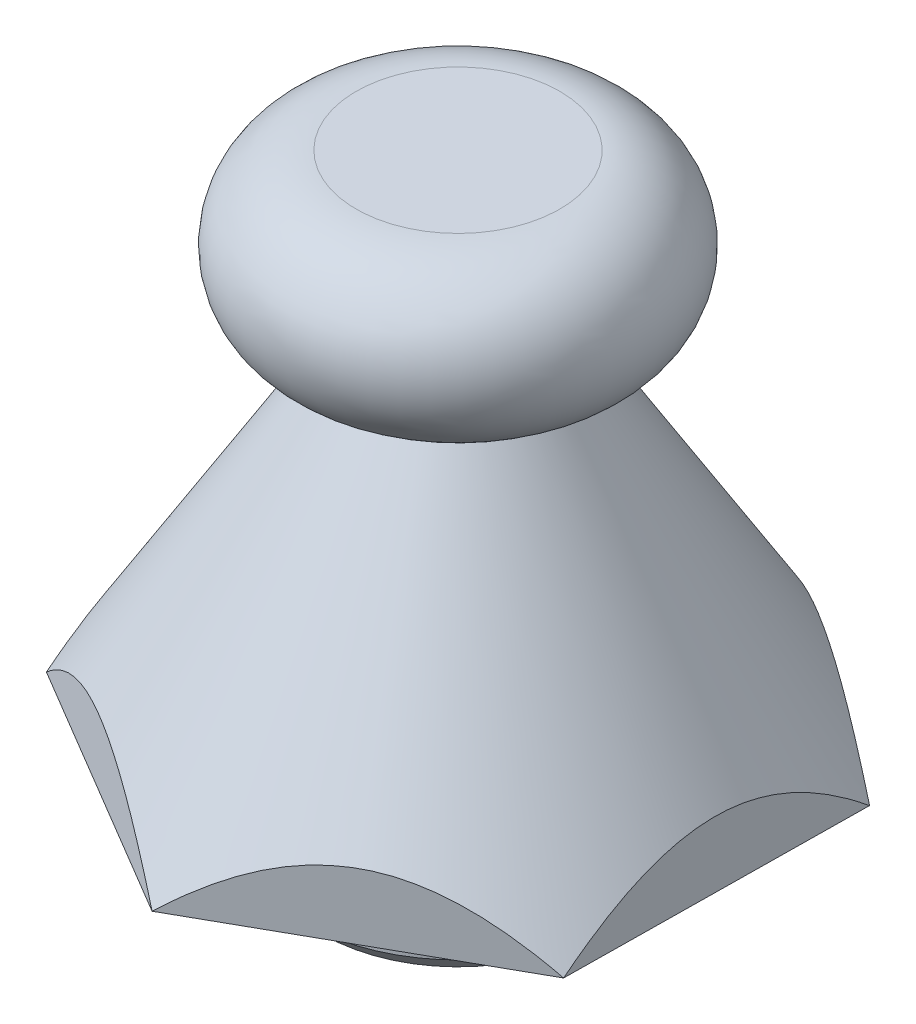
ISO-10303-21;
HEADER;
FILE_DESCRIPTION(('STEP AP214'),'2;1');
FILE_NAME('part.step','',(''),(''),'','','');
FILE_SCHEMA(('AUTOMOTIVE_DESIGN { 1 0 10303 214 1 1 1 1 }'));
ENDSEC;
DATA;
#1=APPLICATION_CONTEXT('core data for automotive mechanical design processes');
#2=APPLICATION_PROTOCOL_DEFINITION('international standard','automotive_design',2000,#1);
#3=PRODUCT_CONTEXT('',#1,'mechanical');
#4=PRODUCT('Part','Part','',(#3));
#5=PRODUCT_RELATED_PRODUCT_CATEGORY('part','',(#4));
#6=PRODUCT_DEFINITION_FORMATION('','',#4);
#7=PRODUCT_DEFINITION_CONTEXT('part definition',#1,'design');
#8=PRODUCT_DEFINITION('design','',#6,#7);
#9=PRODUCT_DEFINITION_SHAPE('','',#8);
#10=(LENGTH_UNIT() NAMED_UNIT(*) SI_UNIT(.MILLI.,.METRE.));
#11=(NAMED_UNIT(*) PLANE_ANGLE_UNIT() SI_UNIT($,.RADIAN.));
#12=(NAMED_UNIT(*) SI_UNIT($,.STERADIAN.) SOLID_ANGLE_UNIT());
#13=UNCERTAINTY_MEASURE_WITH_UNIT(LENGTH_MEASURE(1.E-05),#10,'distance_accuracy_value','');
#14=(GEOMETRIC_REPRESENTATION_CONTEXT(3) GLOBAL_UNCERTAINTY_ASSIGNED_CONTEXT((#13)) GLOBAL_UNIT_ASSIGNED_CONTEXT((#10,
#11,#12)) REPRESENTATION_CONTEXT('',''));
#15=CARTESIAN_POINT('',(0.,0.,0.));
#16=DIRECTION('',(0.,0.,1.));
#17=DIRECTION('',(1.,0.,0.));
#18=AXIS2_PLACEMENT_3D('',#15,#16,#17);
#19=CARTESIAN_POINT('',(0.,22.0499051389259,0.));
#20=DIRECTION('',(0.,-1.,0.));
#21=DIRECTION('',(0.,0.,-1.));
#22=AXIS2_PLACEMENT_3D('',#19,#20,#21);
#23=CONICAL_SURFACE('',#22,4.37011859170475,0.550055987166818);
#24=CARTESIAN_POINT('',(0.,22.0499051389259,0.));
#25=DIRECTION('',(0.,-1.,0.));
#26=DIRECTION('',(0.,0.,-1.));
#27=AXIS2_PLACEMENT_3D('',#24,#25,#26);
#28=CIRCLE('',#27,4.37011859170475);
#29=CARTESIAN_POINT('',(0.,22.0499051389259,-4.37011859170475));
#30=VERTEX_POINT('',#29);
#31=EDGE_CURVE('E157',#30,#30,#28,.T.);
#32=ORIENTED_EDGE('',*,*,#31,.T.);
#33=EDGE_LOOP('',(#32));
#34=FACE_BOUND('',#33,.T.);
#35=CARTESIAN_POINT('',(-12.9274597673464,4.99983690274812,7.25665011409203));
#36=CARTESIAN_POINT('',(-12.925562033689,5.12765644943089,7.09989248446028));
#37=CARTESIAN_POINT('',(-12.9236463152194,5.25367629722847,6.94164926357702));
#38=CARTESIAN_POINT('',(-12.9197754632438,5.50160173039605,6.62190703948685));
#39=CARTESIAN_POINT('',(-12.9178203192118,5.62350619316881,6.4604071668145));
#40=CARTESIAN_POINT('',(-12.9138589637847,5.86317469999667,6.13318912730664));
#41=CARTESIAN_POINT('',(-12.9118525565007,5.9809167426509,5.96745477955683));
#42=CARTESIAN_POINT('',(-12.9077948392632,6.21095729682031,5.63227700928215));
#43=CARTESIAN_POINT('',(-12.9057435325431,6.32325619846829,5.4628338538505));
#44=CARTESIAN_POINT('',(-12.8994201686192,6.65600511931159,4.94050790145305));
#45=CARTESIAN_POINT('',(-12.8950708954838,6.8666322703087,4.58124687202974));
#46=CARTESIAN_POINT('',(-12.8861590453482,7.25335308095187,3.84510537113247));
#47=CARTESIAN_POINT('',(-12.8815969021347,7.42951347115191,3.4682607315272));
#48=CARTESIAN_POINT('',(-12.8742037296137,7.67309965642381,2.85756586646068));
#49=CARTESIAN_POINT('',(-12.8714435786392,7.75524561204784,2.62957037167833));
#50=CARTESIAN_POINT('',(-12.865855309082,7.90215042066149,2.16796508470661));
#51=CARTESIAN_POINT('',(-12.8630271866199,7.96690827866301,1.93435497206851));
#52=CARTESIAN_POINT('',(-12.857337914419,8.07645219761175,1.46440660968411));
#53=CARTESIAN_POINT('',(-12.8544772027412,8.12139215081696,1.22810454489627));
#54=CARTESIAN_POINT('',(-12.8487188421646,8.19034772556694,0.752449306860174));
#55=CARTESIAN_POINT('',(-12.8458211957637,8.21436475456498,0.513096339940646));
#56=CARTESIAN_POINT('',(-12.8399889484323,8.240577817298,0.0313378679272634));
#57=CARTESIAN_POINT('',(-12.8370542346325,8.24260475760101,-0.211076960467528));
#58=CARTESIAN_POINT('',(-12.8311951428656,8.22430981604787,-0.695052851179929));
#59=CARTESIAN_POINT('',(-12.8282707650053,8.20398770380645,-0.936613904670645));
#60=CARTESIAN_POINT('',(-12.8224474564252,8.14177052241376,-1.41763401307725));
#61=CARTESIAN_POINT('',(-12.8195486253622,8.09981242347319,-1.65708483609945));
#62=CARTESIAN_POINT('',(-12.8138041594656,7.99593995594987,-2.13159233820437));
#63=CARTESIAN_POINT('',(-12.8109585318417,7.93402290320351,-2.36664842176319));
#64=CARTESIAN_POINT('',(-12.8043300983338,7.76704380298724,-2.91417389816333));
#65=CARTESIAN_POINT('',(-12.8005750138839,7.65446989826481,-3.22435343001285));
#66=CARTESIAN_POINT('',(-12.793201871369,7.40204272402871,-3.83339376560392));
#67=CARTESIAN_POINT('',(-12.7895838880848,7.26217481584993,-4.13224839225658));
#68=CARTESIAN_POINT('',(-12.7824766523442,6.95998193604779,-4.71932415158735));
#69=CARTESIAN_POINT('',(-12.7789877885587,6.79759520162259,-5.00751317905195));
#70=CARTESIAN_POINT('',(-12.7721422702976,6.45509762963613,-5.57297040853103));
#71=CARTESIAN_POINT('',(-12.7687855835717,6.27499115355317,-5.85024127449555));
#72=CARTESIAN_POINT('',(-12.7624698816624,5.91635879720304,-6.37193432499127));
#73=CARTESIAN_POINT('',(-12.7595012145091,5.73898258375712,-6.61715378679153));
#74=CARTESIAN_POINT('',(-12.7536743623678,5.37559970303515,-7.09846660237594));
#75=CARTESIAN_POINT('',(-12.7508155540785,5.18966140005746,-7.33461144244071));
#76=CARTESIAN_POINT('',(-12.747996391922,4.9998369027481,-7.56748141102802));
#77=B_SPLINE_CURVE_WITH_KNOTS('',3,(#35,#36,#37,#38,#39,#40,#41,#42,#43,#44,#45,#46,#47,#48,#49,
#50,#51,#52,#53,#54,#55,#56,#57,#58,#59,#60,#61,#62,#63,#64,#65,#66,#67,#68,#69,#70,#71,#72,#73,
#74,#75,#76),.UNSPECIFIED.,.F.,.F.,(4,2,2,2,2,2,2,2,2,2,2,2,2,2,2,2,2,2,2,2,4),(0.,
0.60682588087976,1.21381597611449,1.82364152491253,2.43342330011884,3.68142576593079,
4.92698755020254,5.6534828357918,6.38001968430538,7.10081088714821,7.82155359971863,
8.54783459174355,9.27412307070818,10.002539422198,10.7310537750638,11.7193957316417,
12.7082692324382,13.6999106477668,14.6913085915182,15.5990289081939,16.5004557126081),.UNSPECIFIED.);
#78=CARTESIAN_POINT('',(-12.9274573461135,5.,7.25645011409203));
#79=VERTEX_POINT('',#78);
#80=CARTESIAN_POINT('',(-12.7479988131549,5.,-7.56728141102802));
#81=VERTEX_POINT('',#80);
#82=EDGE_CURVE('E141',#79,#81,#77,.T.);
#83=ORIENTED_EDGE('',*,*,#82,.F.);
#84=CARTESIAN_POINT('',(-0.179258532958545,4.99981034561633,14.8238502462075));
#85=CARTESIAN_POINT('',(-0.31406570073963,5.12763026152806,14.7438279784167));
#86=CARTESIAN_POINT('',(-0.450150431360663,5.25365049067823,14.6630473423775));
#87=CARTESIAN_POINT('',(-0.725119765908256,5.5015767147449,14.4998240502811));
#88=CARTESIAN_POINT('',(-0.864005117538875,5.62348158708648,14.4173809503826));
#89=CARTESIAN_POINT('',(-1.14540342111125,5.86315094208051,14.2503413873164));
#90=CARTESIAN_POINT('',(-1.28793028800525,5.98089342371556,14.1657366641573));
#91=CARTESIAN_POINT('',(-1.57617371547943,6.21093489480395,13.9946337983236));
#92=CARTESIAN_POINT('',(-1.72189004637037,6.32323427438226,13.9081357919936));
#93=CARTESIAN_POINT('',(-2.1710756568073,6.6559847501227,13.6414967712516));
#94=CARTESIAN_POINT('',(-2.48003003017721,6.86661304491511,13.4580997753211));
#95=CARTESIAN_POINT('',(-3.11309102045055,7.2533363715792,13.0823113293103));
#96=CARTESIAN_POINT('',(-3.43716682327879,7.42949813280978,12.8899381706326));
#97=CARTESIAN_POINT('',(-3.96234739398073,7.67308672133001,12.5781881282648));
#98=CARTESIAN_POINT('',(-4.15841723410477,7.75523362161038,12.4618000050637));
#99=CARTESIAN_POINT('',(-4.5553850999689,7.90214038065985,12.226157721427));
#100=CARTESIAN_POINT('',(-4.7562834012847,7.9668992444585,12.1069033974083));
#101=CARTESIAN_POINT('',(-5.16042619244511,8.07644520802921,11.8670020391031));
#102=CARTESIAN_POINT('',(-5.3636395637903,8.12138619942421,11.746373476927));
#103=CARTESIAN_POINT('',(-5.77269025188407,8.19034385554624,11.5035587643161));
#104=CARTESIAN_POINT('',(-5.97852739118959,8.21436192773354,11.3813727192125));
#105=CARTESIAN_POINT('',(-6.39282690250491,8.24057704987439,11.1354422765975));
#106=CARTESIAN_POINT('',(-6.60129729318392,8.24260500070699,11.0116931191605));
#107=CARTESIAN_POINT('',(-7.01750393458954,8.22431198608433,10.7646305937542));
#108=CARTESIAN_POINT('',(-7.22524017772747,8.20399079028629,10.6413172302895));
#109=CARTESIAN_POINT('',(-7.63890504804737,8.1417753182725,10.3957635140201));
#110=CARTESIAN_POINT('',(-7.84482659635602,8.09981801331803,10.2735273632733));
#111=CARTESIAN_POINT('',(-8.25289088530694,7.99594699008409,10.031298182557));
#112=CARTESIAN_POINT('',(-8.45503311381646,7.93403058760437,9.91130545659237));
#113=CARTESIAN_POINT('',(-8.92588922813137,7.76705350117418,9.63180270691787));
#114=CARTESIAN_POINT('',(-9.1926339601941,7.65448112224735,9.47346158357661));
#115=CARTESIAN_POINT('',(-9.71638974703504,7.4020570941886,9.16255730065576));
#116=CARTESIAN_POINT('',(-9.97339548986251,7.26219080674623,9.00999729427901));
#117=CARTESIAN_POINT('',(-10.47826258811,6.96000119057321,8.71030543961193));
#118=CARTESIAN_POINT('',(-10.7260963327449,6.79761609593144,8.56318998123381));
#119=CARTESIAN_POINT('',(-11.2123722765299,6.45512180549642,8.2745339369426));
#120=CARTESIAN_POINT('',(-11.4508167665002,6.27501697101192,8.1329919911862));
#121=CARTESIAN_POINT('',(-11.8994687392585,5.91637828686702,7.86666974067174));
#122=CARTESIAN_POINT('',(-12.1103614621976,5.73899344630844,7.74148267363411));
#123=CARTESIAN_POINT('',(-12.5242979048835,5.37559244538745,7.49576775053171));
#124=CARTESIAN_POINT('',(-12.7273859084465,5.18964466022655,7.37521360735285));
#125=CARTESIAN_POINT('',(-12.9276573461135,4.99981034561634,7.25633139300456));
#126=B_SPLINE_CURVE_WITH_KNOTS('',3,(#84,#85,#86,#87,#88,#89,#90,#91,#92,#93,#94,#95,#96,#97,
#98,#99,#100,#101,#102,#103,#104,#105,#106,#107,#108,#109,#110,#111,#112,#113,#114,#115,#116,
#117,#118,#119,#120,#121,#122,#123,#124,#125),.UNSPECIFIED.,.F.,.F.,(4,2,2,2,2,2,2,2,2,2,2,2,2,
2,2,2,2,2,2,2,4),(0.,0.606826432339274,1.21381707704406,1.82364314835334,2.43342544660003,
3.6814291587106,4.9269922143874,5.65348854716281,6.38002644233084,7.10081869547396,
7.82156245802153,8.54784468414054,9.27413439580006,10.0025519355145,10.7310674773966,
11.7194043423393,12.7082727376906,13.699909177393,14.6913021561508,15.599068049677,
16.5005397479154),.UNSPECIFIED.);
#127=CARTESIAN_POINT('',(-0.179458532958554,5.,14.82373152512));
#128=VERTEX_POINT('',#127);
#129=EDGE_CURVE('E100',#128,#79,#126,.T.);
#130=ORIENTED_EDGE('',*,*,#129,.F.);
#131=CARTESIAN_POINT('',(12.7481988131549,4.99981297842271,7.56716914687707));
#132=CARTESIAN_POINT('',(12.6114939069711,5.12763285773009,7.64390444798969));
#133=CARTESIAN_POINT('',(12.4734934527446,5.25365304907401,7.72136696710738));
#134=CARTESIAN_POINT('',(12.1946532551389,5.50157919473311,7.87788575727286));
#135=CARTESIAN_POINT('',(12.0538127535286,5.62348402647117,7.95694245393145));
#136=CARTESIAN_POINT('',(11.768453081258,5.86315329738037,8.11712076053622));
#137=CARTESIAN_POINT('',(11.6239197997404,5.98089573549608,8.19825029119938));
#138=CARTESIAN_POINT('',(11.3316186396615,6.2109371156837,8.36232499897952));
#139=CARTESIAN_POINT('',(11.1838509940232,6.32323644788135,8.44527004535197));
#140=CARTESIAN_POINT('',(10.7283419979247,6.65598676947375,8.70095669882236));
#141=CARTESIAN_POINT('',(10.4150383368833,6.86661495087362,8.87682054629368));
#142=CARTESIAN_POINT('',(9.77306546835773,7.2533380281067,9.23717324136229));
#143=CARTESIAN_POINT('',(9.44442750876459,7.42949965341728,9.42164454886977));
#144=CARTESIAN_POINT('',(8.91185375601896,7.67308800368625,9.7205892497034));
#145=CARTESIAN_POINT('',(8.7130237670976,7.75523481031599,9.83219664914511));
#146=CARTESIAN_POINT('',(8.31046763994197,7.90214137600459,10.058159758256));
#147=CARTESIAN_POINT('',(8.10674122225247,7.96690014009127,10.1725156247893));
#148=CARTESIAN_POINT('',(7.69690917678493,8.07644590096372,10.4025628578584));
#149=CARTESIAN_POINT('',(7.49083510552961,8.1213867894354,10.518236511063));
#150=CARTESIAN_POINT('',(7.07602608701506,8.19034423921581,10.751077422399));
#151=CARTESIAN_POINT('',(6.86729131969622,8.21436220798412,10.8682445795261));
#152=CARTESIAN_POINT('',(6.44715960944135,8.24057712596073,11.1040732282069));
#153=CARTESIAN_POINT('',(6.23575453504352,8.24260497661206,11.2227392841189));
#154=CARTESIAN_POINT('',(5.81368886853807,8.22431177095852,11.4596535025818));
#155=CARTESIAN_POINT('',(5.60302828412618,8.20399048430665,11.577901660813));
#156=CARTESIAN_POINT('',(5.18354018225821,8.14177484282944,11.8133690387484));
#157=CARTESIAN_POINT('',(4.97471984336042,8.09981745916123,11.9305842289787));
#158=CARTESIAN_POINT('',(4.56091117244337,7.99594629274416,12.1628636244463));
#159=CARTESIAN_POINT('',(4.35592335976648,7.93402982579868,12.2779275381659));
#160=CARTESIAN_POINT('',(3.87843875655144,7.76705253972782,12.5459495560083));
#161=CARTESIAN_POINT('',(3.60793884666509,7.6544800095385,12.6977867695766));
#162=CARTESIAN_POINT('',(3.07680974055626,7.4020556695778,12.9959205602697));
#163=CARTESIAN_POINT('',(2.81618593108048,7.26218922146081,13.1422141137019));
#164=CARTESIAN_POINT('',(2.30421144100594,6.95999928174204,13.4295960208664));
#165=CARTESIAN_POINT('',(2.05288875976046,6.79761402453738,13.5706686579806));
#166=CARTESIAN_POINT('',(1.55976715743556,6.45511940877987,13.8474680479649));
#167=CARTESIAN_POINT('',(1.31796591327686,6.27501441155257,13.9831961048275));
#168=CARTESIAN_POINT('',(0.862999136796566,5.91637635472478,14.2385783991726));
#169=CARTESIAN_POINT('',(0.649138678096696,5.73899236943247,14.3586227132541));
#170=CARTESIAN_POINT('',(0.229377176638012,5.3755931648961,14.594243556054));
#171=CARTESIAN_POINT('',(0.0234312273702775,5.18964631977258,14.7098452917279));
#172=CARTESIAN_POINT('',(-0.179658532958545,4.99981297842272,14.823843789271));
#173=B_SPLINE_CURVE_WITH_KNOTS('',3,(#131,#132,#133,#134,#135,#136,#137,#138,#139,#140,#141,
#142,#143,#144,#145,#146,#147,#148,#149,#150,#151,#152,#153,#154,#155,#156,#157,#158,#159,#160,
#161,#162,#163,#164,#165,#166,#167,#168,#169,#170,#171,#172),.UNSPECIFIED.,.F.,.F.,(4,2,2,2,2,2,
2,2,2,2,2,2,2,2,2,2,2,2,2,2,4),(0.,0.606826377668814,1.21381696790037,1.82364298740903,
2.43342523380267,3.68142882235848,4.92699175199155,5.65348798095099,6.38002577235577,
7.10081792137414,7.82156157982899,8.54784368360244,9.27413327305509,10.0025506949714,
10.7310661189769,11.7194034886872,12.7082723901753,13.6999093231446,14.6913027941153,
15.5990641692823,16.5005314168766),.UNSPECIFIED.);
#174=CARTESIAN_POINT('',(12.7479988131549,5.,7.56728141102801));
#175=VERTEX_POINT('',#174);
#176=EDGE_CURVE('E86',#175,#128,#173,.T.);
#177=ORIENTED_EDGE('',*,*,#176,.F.);
#178=CARTESIAN_POINT('',(12.9274597673464,4.9998369027481,-7.25665011409203));
#179=CARTESIAN_POINT('',(12.925562033689,5.12765644943087,-7.09989248446028));
#180=CARTESIAN_POINT('',(12.9236463152194,5.25367629722845,-6.94164926357703));
#181=CARTESIAN_POINT('',(12.9197754632438,5.50160173039604,-6.62190703948685));
#182=CARTESIAN_POINT('',(12.9178203192118,5.6235061931688,-6.46040716681451));
#183=CARTESIAN_POINT('',(12.9138589637847,5.86317469999666,-6.13318912730664));
#184=CARTESIAN_POINT('',(12.9118525565007,5.98091674265089,-5.96745477955684));
#185=CARTESIAN_POINT('',(12.9077948392632,6.2109572968203,-5.63227700928215));
#186=CARTESIAN_POINT('',(12.9057435325431,6.32325619846828,-5.4628338538505));
#187=CARTESIAN_POINT('',(12.8994201686192,6.65600511931158,-4.94050790145305));
#188=CARTESIAN_POINT('',(12.8950708954838,6.86663227030869,-4.58124687202975));
#189=CARTESIAN_POINT('',(12.8861590453482,7.25335308095186,-3.84510537113247));
#190=CARTESIAN_POINT('',(12.8815969021347,7.4295134711519,-3.4682607315272));
#191=CARTESIAN_POINT('',(12.8742037296137,7.6730996564238,-2.85756586646068));
#192=CARTESIAN_POINT('',(12.8714435786392,7.75524561204784,-2.62957037167833));
#193=CARTESIAN_POINT('',(12.865855309082,7.90215042066149,-2.16796508470661));
#194=CARTESIAN_POINT('',(12.8630271866199,7.966908278663,-1.9343549720685));
#195=CARTESIAN_POINT('',(12.857337914419,8.07645219761174,-1.46440660968411));
#196=CARTESIAN_POINT('',(12.8544772027412,8.12139215081695,-1.22810454489627));
#197=CARTESIAN_POINT('',(12.8487188421646,8.19034772556693,-0.752449306860174));
#198=CARTESIAN_POINT('',(12.8458211957637,8.21436475456498,-0.513096339940646));
#199=CARTESIAN_POINT('',(12.8399889484323,8.240577817298,-0.031337867927263));
#200=CARTESIAN_POINT('',(12.8370542346326,8.24260475760101,0.211076960467529));
#201=CARTESIAN_POINT('',(12.8311951428656,8.22430981604786,0.695052851179931));
#202=CARTESIAN_POINT('',(12.8282707650053,8.20398770380644,0.936613904670647));
#203=CARTESIAN_POINT('',(12.8224474564252,8.14177052241375,1.41763401307725));
#204=CARTESIAN_POINT('',(12.8195486253622,8.09981242347318,1.65708483609945));
#205=CARTESIAN_POINT('',(12.8138041594657,7.99593995594986,2.13159233820437));
#206=CARTESIAN_POINT('',(12.8109585318417,7.9340229032035,2.36664842176319));
#207=CARTESIAN_POINT('',(12.8043300983338,7.76704380298724,2.91417389816333));
#208=CARTESIAN_POINT('',(12.8005750138839,7.6544698982648,3.22435343001285));
#209=CARTESIAN_POINT('',(12.793201871369,7.4020427240287,3.83339376560391));
#210=CARTESIAN_POINT('',(12.7895838880848,7.26217481584992,4.13224839225658));
#211=CARTESIAN_POINT('',(12.7824766523442,6.95998193604779,4.71932415158735));
#212=CARTESIAN_POINT('',(12.7789877885587,6.79759520162259,5.00751317905196));
#213=CARTESIAN_POINT('',(12.7721422702976,6.45509762963612,5.57297040853103));
#214=CARTESIAN_POINT('',(12.7687855835717,6.27499115355316,5.85024127449556));
#215=CARTESIAN_POINT('',(12.7624698816624,5.91635879720304,6.37193432499127));
#216=CARTESIAN_POINT('',(12.7595012145091,5.73898258375712,6.61715378679153));
#217=CARTESIAN_POINT('',(12.7536743623678,5.37559970303516,7.09846660237594));
#218=CARTESIAN_POINT('',(12.7508155540785,5.18966140005747,7.3346114424407));
#219=CARTESIAN_POINT('',(12.747996391922,4.9998369027481,7.56748141102801));
#220=B_SPLINE_CURVE_WITH_KNOTS('',3,(#178,#179,#180,#181,#182,#183,#184,#185,#186,#187,#188,
#189,#190,#191,#192,#193,#194,#195,#196,#197,#198,#199,#200,#201,#202,#203,#204,#205,#206,#207,
#208,#209,#210,#211,#212,#213,#214,#215,#216,#217,#218,#219),.UNSPECIFIED.,.F.,.F.,(4,2,2,2,2,2,
2,2,2,2,2,2,2,2,2,2,2,2,2,2,4),(0.,0.606825880879759,1.21381597611449,1.82364152491252,
2.43342330011884,3.68142576593079,4.92698755020254,5.6534828357918,6.38001968430538,
7.10081088714821,7.82155359971864,8.54783459174356,9.27412307070818,10.002539422198,
10.7310537750638,11.7193957316417,12.7082692324382,13.6999106477668,14.6913085915182,
15.5990289081939,16.5004557126081),.UNSPECIFIED.);
#221=CARTESIAN_POINT('',(12.9274573461135,5.,-7.25645011409203));
#222=VERTEX_POINT('',#221);
#223=EDGE_CURVE('E78',#222,#175,#220,.T.);
#224=ORIENTED_EDGE('',*,*,#223,.F.);
#225=CARTESIAN_POINT('',(0.179258532958551,4.99981034561632,-14.8238502462075));
#226=CARTESIAN_POINT('',(0.314065700739634,5.12763026152806,-14.7438279784167));
#227=CARTESIAN_POINT('',(0.450150431360667,5.25365049067823,-14.6630473423775));
#228=CARTESIAN_POINT('',(0.72511976590826,5.50157671474489,-14.4998240502811));
#229=CARTESIAN_POINT('',(0.86400511753888,5.62348158708647,-14.4173809503826));
#230=CARTESIAN_POINT('',(1.14540342111125,5.86315094208051,-14.2503413873164));
#231=CARTESIAN_POINT('',(1.28793028800525,5.98089342371556,-14.1657366641573));
#232=CARTESIAN_POINT('',(1.57617371547943,6.21093489480395,-13.9946337983236));
#233=CARTESIAN_POINT('',(1.72189004637037,6.32323427438226,-13.9081357919936));
#234=CARTESIAN_POINT('',(2.17107565680731,6.65598475012269,-13.6414967712516));
#235=CARTESIAN_POINT('',(2.48003003017722,6.86661304491511,-13.4580997753211));
#236=CARTESIAN_POINT('',(3.11309102045055,7.2533363715792,-13.0823113293103));
#237=CARTESIAN_POINT('',(3.43716682327879,7.42949813280978,-12.8899381706326));
#238=CARTESIAN_POINT('',(3.96234739398073,7.67308672133,-12.5781881282648));
#239=CARTESIAN_POINT('',(4.15841723410477,7.75523362161038,-12.4618000050637));
#240=CARTESIAN_POINT('',(4.55538509996891,7.90214038065984,-12.226157721427));
#241=CARTESIAN_POINT('',(4.7562834012847,7.96689924445849,-12.1069033974083));
#242=CARTESIAN_POINT('',(5.16042619244511,8.0764452080292,-11.8670020391031));
#243=CARTESIAN_POINT('',(5.3636395637903,8.12138619942421,-11.746373476927));
#244=CARTESIAN_POINT('',(5.77269025188408,8.19034385554623,-11.5035587643161));
#245=CARTESIAN_POINT('',(5.9785273911896,8.21436192773353,-11.3813727192125));
#246=CARTESIAN_POINT('',(6.39282690250492,8.24057704987439,-11.1354422765975));
#247=CARTESIAN_POINT('',(6.60129729318393,8.24260500070698,-11.0116931191605));
#248=CARTESIAN_POINT('',(7.01750393458955,8.22431198608432,-10.7646305937542));
#249=CARTESIAN_POINT('',(7.22524017772748,8.20399079028628,-10.6413172302895));
#250=CARTESIAN_POINT('',(7.63890504804738,8.14177531827249,-10.3957635140202));
#251=CARTESIAN_POINT('',(7.84482659635602,8.09981801331802,-10.2735273632732));
#252=CARTESIAN_POINT('',(8.25289088530695,7.99594699008409,-10.031298182557));
#253=CARTESIAN_POINT('',(8.45503311381647,7.93403058760437,-9.91130545659237));
#254=CARTESIAN_POINT('',(8.92588922813138,7.76705350117418,-9.63180270691787));
#255=CARTESIAN_POINT('',(9.19263396019412,7.65448112224735,-9.47346158357661));
#256=CARTESIAN_POINT('',(9.71638974703506,7.4020570941886,-9.16255730065576));
#257=CARTESIAN_POINT('',(9.97339548986253,7.26219080674622,-9.009997294279));
#258=CARTESIAN_POINT('',(10.4782625881101,6.9600011905732,-8.71030543961192));
#259=CARTESIAN_POINT('',(10.7260963327449,6.79761609593142,-8.56318998123381));
#260=CARTESIAN_POINT('',(11.2123722765299,6.45512180549641,-8.27453393694259));
#261=CARTESIAN_POINT('',(11.4508167665002,6.27501697101191,-8.1329919911862));
#262=CARTESIAN_POINT('',(11.8994687392585,5.91637828686701,-7.86666974067174));
#263=CARTESIAN_POINT('',(12.1103614621976,5.73899344630843,-7.74148267363411));
#264=CARTESIAN_POINT('',(12.5242979048835,5.37559244538744,-7.49576775053171));
#265=CARTESIAN_POINT('',(12.7273859084465,5.18964466022654,-7.37521360735285));
#266=CARTESIAN_POINT('',(12.9276573461135,4.99981034561632,-7.25633139300456));
#267=B_SPLINE_CURVE_WITH_KNOTS('',3,(#225,#226,#227,#228,#229,#230,#231,#232,#233,#234,#235,
#236,#237,#238,#239,#240,#241,#242,#243,#244,#245,#246,#247,#248,#249,#250,#251,#252,#253,#254,
#255,#256,#257,#258,#259,#260,#261,#262,#263,#264,#265,#266),.UNSPECIFIED.,.F.,.F.,(4,2,2,2,2,2,
2,2,2,2,2,2,2,2,2,2,2,2,2,2,4),(0.,0.606826432339276,1.21381707704406,1.82364314835334,
2.43342544660004,3.6814291587106,4.9269922143874,5.65348854716281,6.38002644233084,
7.10081869547397,7.82156245802153,8.54784468414055,9.27413439580007,10.0025519355145,
10.7310674773966,11.7194043423393,12.7082727376906,13.699909177393,14.6913021561508,
15.5990680496771,16.5005397479154),.UNSPECIFIED.);
#268=CARTESIAN_POINT('',(0.179458532958552,5.,-14.82373152512));
#269=VERTEX_POINT('',#268);
#270=EDGE_CURVE('E85',#269,#222,#267,.T.);
#271=ORIENTED_EDGE('',*,*,#270,.F.);
#272=CARTESIAN_POINT('',(-12.7481988131549,4.99981297842271,-7.56716914687708));
#273=CARTESIAN_POINT('',(-12.6114939069711,5.12763285773009,-7.6439044479897));
#274=CARTESIAN_POINT('',(-12.4734934527446,5.25365304907401,-7.72136696710739));
#275=CARTESIAN_POINT('',(-12.1946532551389,5.50157919473311,-7.87788575727287));
#276=CARTESIAN_POINT('',(-12.0538127535286,5.62348402647116,-7.95694245393146));
#277=CARTESIAN_POINT('',(-11.768453081258,5.86315329738037,-8.11712076053622));
#278=CARTESIAN_POINT('',(-11.6239197997404,5.98089573549608,-8.19825029119938));
#279=CARTESIAN_POINT('',(-11.3316186396615,6.2109371156837,-8.36232499897952));
#280=CARTESIAN_POINT('',(-11.1838509940232,6.32323644788134,-8.44527004535198));
#281=CARTESIAN_POINT('',(-10.7283419979247,6.65598676947375,-8.70095669882237));
#282=CARTESIAN_POINT('',(-10.4150383368833,6.86661495087362,-8.8768205462937));
#283=CARTESIAN_POINT('',(-9.77306546835772,7.25333802810669,-9.2371732413623));
#284=CARTESIAN_POINT('',(-9.44442750876458,7.42949965341728,-9.42164454886978));
#285=CARTESIAN_POINT('',(-8.91185375601895,7.67308800368625,-9.72058924970341));
#286=CARTESIAN_POINT('',(-8.7130237670976,7.75523481031599,-9.83219664914511));
#287=CARTESIAN_POINT('',(-8.31046763994197,7.90214137600459,-10.0581597582561));
#288=CARTESIAN_POINT('',(-8.10674122225247,7.96690014009127,-10.1725156247893));
#289=CARTESIAN_POINT('',(-7.69690917678492,8.07644590096372,-10.4025628578584));
#290=CARTESIAN_POINT('',(-7.49083510552961,8.1213867894354,-10.518236511063));
#291=CARTESIAN_POINT('',(-7.07602608701505,8.19034423921581,-10.751077422399));
#292=CARTESIAN_POINT('',(-6.86729131969621,8.21436220798411,-10.8682445795261));
#293=CARTESIAN_POINT('',(-6.44715960944135,8.24057712596073,-11.1040732282069));
#294=CARTESIAN_POINT('',(-6.23575453504351,8.24260497661206,-11.2227392841189));
#295=CARTESIAN_POINT('',(-5.81368886853806,8.22431177095852,-11.4596535025818));
#296=CARTESIAN_POINT('',(-5.60302828412617,8.20399048430665,-11.577901660813));
#297=CARTESIAN_POINT('',(-5.1835401822582,8.14177484282943,-11.8133690387484));
#298=CARTESIAN_POINT('',(-4.97471984336041,8.09981745916122,-11.9305842289787));
#299=CARTESIAN_POINT('',(-4.56091117244336,7.99594629274415,-12.1628636244463));
#300=CARTESIAN_POINT('',(-4.35592335976647,7.93402982579867,-12.2779275381659));
#301=CARTESIAN_POINT('',(-3.87843875655143,7.76705253972782,-12.5459495560083));
#302=CARTESIAN_POINT('',(-3.60793884666508,7.6544800095385,-12.6977867695766));
#303=CARTESIAN_POINT('',(-3.07680974055625,7.4020556695778,-12.9959205602697));
#304=CARTESIAN_POINT('',(-2.81618593108047,7.26218922146081,-13.1422141137019));
#305=CARTESIAN_POINT('',(-2.30421144100593,6.95999928174203,-13.4295960208664));
#306=CARTESIAN_POINT('',(-2.05288875976045,6.79761402453738,-13.5706686579806));
#307=CARTESIAN_POINT('',(-1.55976715743556,6.45511940877986,-13.8474680479649));
#308=CARTESIAN_POINT('',(-1.31796591327686,6.27501441155256,-13.9831961048275));
#309=CARTESIAN_POINT('',(-0.862999136796556,5.91637635472477,-14.2385783991726));
#310=CARTESIAN_POINT('',(-0.649138678096687,5.73899236943246,-14.3586227132541));
#311=CARTESIAN_POINT('',(-0.229377176638003,5.37559316489609,-14.5942435560541));
#312=CARTESIAN_POINT('',(-0.0234312273702695,5.18964631977258,-14.7098452917279));
#313=CARTESIAN_POINT('',(0.179658532958552,4.99981297842272,-14.823843789271));
#314=B_SPLINE_CURVE_WITH_KNOTS('',3,(#272,#273,#274,#275,#276,#277,#278,#279,#280,#281,#282,
#283,#284,#285,#286,#287,#288,#289,#290,#291,#292,#293,#294,#295,#296,#297,#298,#299,#300,#301,
#302,#303,#304,#305,#306,#307,#308,#309,#310,#311,#312,#313),.UNSPECIFIED.,.F.,.F.,(4,2,2,2,2,2,
2,2,2,2,2,2,2,2,2,2,2,2,2,2,4),(0.,0.606826377668815,1.21381696790037,1.82364298740904,
2.43342523380267,3.68142882235849,4.92699175199155,5.65348798095099,6.38002577235577,
7.10081792137415,7.821561579829,8.54784368360244,9.2741332730551,10.0025506949714,
10.7310661189769,11.7194034886872,12.7082723901753,13.6999093231446,14.6913027941153,
15.5990641692823,16.5005314168767),.UNSPECIFIED.);
#315=EDGE_CURVE('E149',#81,#269,#314,.T.);
#316=ORIENTED_EDGE('',*,*,#315,.F.);
#317=EDGE_LOOP('',(#83,#130,#177,#224,#271,#316));
#318=FACE_BOUND('',#317,.T.);
#319=ADVANCED_FACE('F40',(#34,#318),#23,.T.);
#320=CARTESIAN_POINT('',(0.,30.,0.));
#321=DIRECTION('',(0.,-1.,0.));
#322=DIRECTION('',(0.,0.,-1.));
#323=AXIS2_PLACEMENT_3D('',#320,#321,#322);
#324=PLANE('',#323);
#325=CARTESIAN_POINT('',(0.,30.,0.));
#326=DIRECTION('',(0.,-1.,0.));
#327=DIRECTION('',(0.,0.,-1.));
#328=AXIS2_PLACEMENT_3D('',#325,#326,#327);
#329=CIRCLE('',#328,5.);
#330=CARTESIAN_POINT('',(0.,30.,-5.));
#331=VERTEX_POINT('',#330);
#332=EDGE_CURVE('E160',#331,#331,#329,.T.);
#333=ORIENTED_EDGE('',*,*,#332,.F.);
#334=EDGE_LOOP('',(#333));
#335=FACE_BOUND('',#334,.T.);
#336=ADVANCED_FACE('F181',(#335),#324,.F.);
#337=CARTESIAN_POINT('',(0.,26.,0.));
#338=DIRECTION('',(0.,-1.,0.));
#339=DIRECTION('',(0.,0.,-1.));
#340=AXIS2_PLACEMENT_3D('',#337,#338,#339);
#341=TOROIDAL_SURFACE('',#340,5.,4.);
#342=ORIENTED_EDGE('',*,*,#31,.F.);
#343=EDGE_LOOP('',(#342));
#344=FACE_BOUND('',#343,.T.);
#345=ORIENTED_EDGE('',*,*,#332,.T.);
#346=EDGE_LOOP('',(#345));
#347=FACE_BOUND('',#346,.T.);
#348=ADVANCED_FACE('F131',(#344,#347),#341,.T.);
#349=CARTESIAN_POINT('',(-12.9274573461135,0.,7.25645011409203));
#350=DIRECTION('',(-0.510446842060062,0.,0.859909310003625));
#351=DIRECTION('',(0.859909310003625,0.,0.510446842060062));
#352=AXIS2_PLACEMENT_3D('',#349,#350,#351);
#353=PLANE('',#352);
#354=ORIENTED_EDGE('',*,*,#129,.T.);
#355=DIRECTION('',(0.859909310003625,0.,0.510446842060062));
#356=VECTOR('',#355,1.);
#357=CARTESIAN_POINT('',(-17.5155808028831,5.,4.53291508284568));
#358=LINE('',#357,#356);
#359=EDGE_CURVE('E92',#79,#128,#358,.T.);
#360=ORIENTED_EDGE('',*,*,#359,.T.);
#361=EDGE_LOOP('',(#354,#360));
#362=FACE_BOUND('',#361,.T.);
#363=ADVANCED_FACE('F125',(#362),#353,.T.);
#364=CARTESIAN_POINT('',(-0.179458532958545,0.,14.82373152512));
#365=DIRECTION('',(0.489479886383856,0.,0.872014587507369));
#366=DIRECTION('',(0.872014587507369,0.,-0.489479886383856));
#367=AXIS2_PLACEMENT_3D('',#364,#365,#366);
#368=PLANE('',#367);
#369=ORIENTED_EDGE('',*,*,#176,.T.);
#370=DIRECTION('',(0.872014587507369,0.,-0.489479886383856));
#371=VECTOR('',#370,1.);
#372=CARTESIAN_POINT('',(-4.98866124509206,5.,17.5232368210818));
#373=LINE('',#372,#371);
#374=EDGE_CURVE('E63',#128,#175,#373,.T.);
#375=ORIENTED_EDGE('',*,*,#374,.T.);
#376=EDGE_LOOP('',(#369,#375));
#377=FACE_BOUND('',#376,.T.);
#378=ADVANCED_FACE('F90',(#377),#368,.T.);
#379=CARTESIAN_POINT('',(12.7479988131549,0.,7.56728141102801));
#380=DIRECTION('',(0.999926728443918,0.,0.0121052775037447));
#381=DIRECTION('',(0.0121052775037447,0.,-0.999926728443918));
#382=AXIS2_PLACEMENT_3D('',#379,#380,#381);
#383=PLANE('',#382);
#384=ORIENTED_EDGE('',*,*,#223,.T.);
#385=DIRECTION('',(0.0121052775037447,0.,-0.999926728443918));
#386=VECTOR('',#385,1.);
#387=CARTESIAN_POINT('',(12.8355556842923,5.,0.334861032220578));
#388=LINE('',#387,#386);
#389=EDGE_CURVE('E80',#175,#222,#388,.T.);
#390=ORIENTED_EDGE('',*,*,#389,.T.);
#391=EDGE_LOOP('',(#384,#390));
#392=FACE_BOUND('',#391,.T.);
#393=ADVANCED_FACE('F79',(#392),#383,.T.);
#394=CARTESIAN_POINT('',(12.9274573461135,0.,-7.25645011409203));
#395=DIRECTION('',(0.510446842060062,0.,-0.859909310003624));
#396=DIRECTION('',(-0.859909310003625,0.,-0.510446842060063));
#397=AXIS2_PLACEMENT_3D('',#394,#395,#396);
#398=PLANE('',#397);
#399=ORIENTED_EDGE('',*,*,#270,.T.);
#400=DIRECTION('',(-0.859909310003625,0.,-0.510446842060063));
#401=VECTOR('',#400,1.);
#402=CARTESIAN_POINT('',(-4.40866492381106,5.,-17.5472665563664));
#403=LINE('',#402,#401);
#404=EDGE_CURVE('E97',#222,#269,#403,.T.);
#405=ORIENTED_EDGE('',*,*,#404,.T.);
#406=EDGE_LOOP('',(#399,#405));
#407=FACE_BOUND('',#406,.T.);
#408=ADVANCED_FACE('F210',(#407),#398,.T.);
#409=CARTESIAN_POINT('',(0.179458532958552,0.,-14.82373152512));
#410=DIRECTION('',(-0.489479886383855,0.,-0.87201458750737));
#411=DIRECTION('',(-0.87201458750737,0.,0.489479886383855));
#412=AXIS2_PLACEMENT_3D('',#409,#410,#411);
#413=PLANE('',#412);
#414=ORIENTED_EDGE('',*,*,#315,.T.);
#415=DIRECTION('',(-0.87201458750737,0.,0.489479886383855));
#416=VECTOR('',#415,1.);
#417=CARTESIAN_POINT('',(-17.5572015252884,5.,-4.86777611506628));
#418=LINE('',#417,#416);
#419=EDGE_CURVE('E165',#269,#81,#418,.T.);
#420=ORIENTED_EDGE('',*,*,#419,.T.);
#421=EDGE_LOOP('',(#414,#420));
#422=FACE_BOUND('',#421,.T.);
#423=ADVANCED_FACE('F138',(#422),#413,.T.);
#424=CARTESIAN_POINT('',(-12.7479988131549,0.,-7.56728141102802));
#425=DIRECTION('',(-0.999926728443918,0.,-0.0121052775037444));
#426=DIRECTION('',(-0.0121052775037444,0.,0.999926728443918));
#427=AXIS2_PLACEMENT_3D('',#424,#425,#426);
#428=PLANE('',#427);
#429=ORIENTED_EDGE('',*,*,#82,.T.);
#430=DIRECTION('',(-0.0121052775037444,0.,0.999926728443918));
#431=VECTOR('',#430,1.);
#432=CARTESIAN_POINT('',(-12.8399004749761,5.,0.0240297352845959));
#433=LINE('',#432,#431);
#434=EDGE_CURVE('E55',#81,#79,#433,.T.);
#435=ORIENTED_EDGE('',*,*,#434,.T.);
#436=EDGE_LOOP('',(#429,#435));
#437=FACE_BOUND('',#436,.T.);
#438=ADVANCED_FACE('F133',(#437),#428,.T.);
#439=CARTESIAN_POINT('',(-7.6271186440678,0.,0.));
#440=DIRECTION('',(0.,1.,0.));
#441=DIRECTION('',(0.,0.,1.));
#442=AXIS2_PLACEMENT_3D('',#439,#440,#441);
#443=PLANE('',#442);
#444=CARTESIAN_POINT('',(0.,0.,0.));
#445=DIRECTION('',(0.,1.,0.));
#446=DIRECTION('',(0.,0.,1.));
#447=AXIS2_PLACEMENT_3D('',#444,#445,#446);
#448=CIRCLE('',#447,6.62711864406779);
#449=CARTESIAN_POINT('',(0.,0.,6.62711864406779));
#450=VERTEX_POINT('',#449);
#451=EDGE_CURVE('E49',#450,#450,#448,.F.);
#452=ORIENTED_EDGE('',*,*,#451,.T.);
#453=EDGE_LOOP('',(#452));
#454=FACE_BOUND('',#453,.T.);
#455=ADVANCED_FACE('F137',(#454),#443,.F.);
#456=CARTESIAN_POINT('',(0.,0.,0.));
#457=DIRECTION('',(0.,-1.,0.));
#458=DIRECTION('',(0.,0.,-1.));
#459=AXIS2_PLACEMENT_3D('',#456,#457,#458);
#460=CYLINDRICAL_SURFACE('',#459,7.6271186440678);
#461=CARTESIAN_POINT('',(0.,1.00000000000001,0.));
#462=DIRECTION('',(0.,1.,0.));
#463=DIRECTION('',(0.,0.,1.));
#464=AXIS2_PLACEMENT_3D('',#461,#462,#463);
#465=CIRCLE('',#464,7.6271186440678);
#466=CARTESIAN_POINT('',(0.,1.00000000000001,7.6271186440678));
#467=VERTEX_POINT('',#466);
#468=EDGE_CURVE('E12',#467,#467,#465,.T.);
#469=ORIENTED_EDGE('',*,*,#468,.T.);
#470=EDGE_LOOP('',(#469));
#471=FACE_BOUND('',#470,.T.);
#472=CARTESIAN_POINT('',(0.,5.,0.));
#473=DIRECTION('',(0.,-1.,0.));
#474=DIRECTION('',(0.,0.,-1.));
#475=AXIS2_PLACEMENT_3D('',#472,#473,#474);
#476=CIRCLE('',#475,7.62711864406781);
#477=CARTESIAN_POINT('',(0.,5.,-7.62711864406781));
#478=VERTEX_POINT('',#477);
#479=EDGE_CURVE('E148',#478,#478,#476,.T.);
#480=ORIENTED_EDGE('',*,*,#479,.T.);
#481=EDGE_LOOP('',(#480));
#482=FACE_BOUND('',#481,.T.);
#483=ADVANCED_FACE('F177',(#471,#482),#460,.T.);
#484=CARTESIAN_POINT('',(-14.8248177625861,5.,0.));
#485=DIRECTION('',(0.,1.,0.));
#486=DIRECTION('',(0.,0.,1.));
#487=AXIS2_PLACEMENT_3D('',#484,#485,#486);
#488=PLANE('',#487);
#489=ORIENTED_EDGE('',*,*,#479,.F.);
#490=EDGE_LOOP('',(#489));
#491=FACE_BOUND('',#490,.T.);
#492=ORIENTED_EDGE('',*,*,#434,.F.);
#493=ORIENTED_EDGE('',*,*,#419,.F.);
#494=ORIENTED_EDGE('',*,*,#404,.F.);
#495=ORIENTED_EDGE('',*,*,#389,.F.);
#496=ORIENTED_EDGE('',*,*,#374,.F.);
#497=ORIENTED_EDGE('',*,*,#359,.F.);
#498=EDGE_LOOP('',(#492,#493,#494,#495,#496,#497));
#499=FACE_BOUND('',#498,.T.);
#500=ADVANCED_FACE('F94',(#491,#499),#488,.F.);
#501=CARTESIAN_POINT('',(0.,0.,0.));
#502=DIRECTION('',(0.,1.,0.));
#503=DIRECTION('',(0.,0.,1.));
#504=AXIS2_PLACEMENT_3D('',#501,#502,#503);
#505=CONICAL_SURFACE('',#504,6.62711864406779,0.785398163397449);
#506=ORIENTED_EDGE('',*,*,#468,.F.);
#507=EDGE_LOOP('',(#506));
#508=FACE_BOUND('',#507,.T.);
#509=ORIENTED_EDGE('',*,*,#451,.F.);
#510=EDGE_LOOP('',(#509));
#511=FACE_BOUND('',#510,.T.);
#512=ADVANCED_FACE('F43',(#508,#511),#505,.T.);
#513=CLOSED_SHELL('',(#319,#336,#348,#363,#378,#393,#408,#423,#438,#455,#483,#500,#512));
#514=MANIFOLD_SOLID_BREP('B2',#513);
#515=ADVANCED_BREP_SHAPE_REPRESENTATION('',(#18,#514),#14);
#516=SHAPE_DEFINITION_REPRESENTATION(#9,#515);
ENDSEC;
END-ISO-10303-21;
